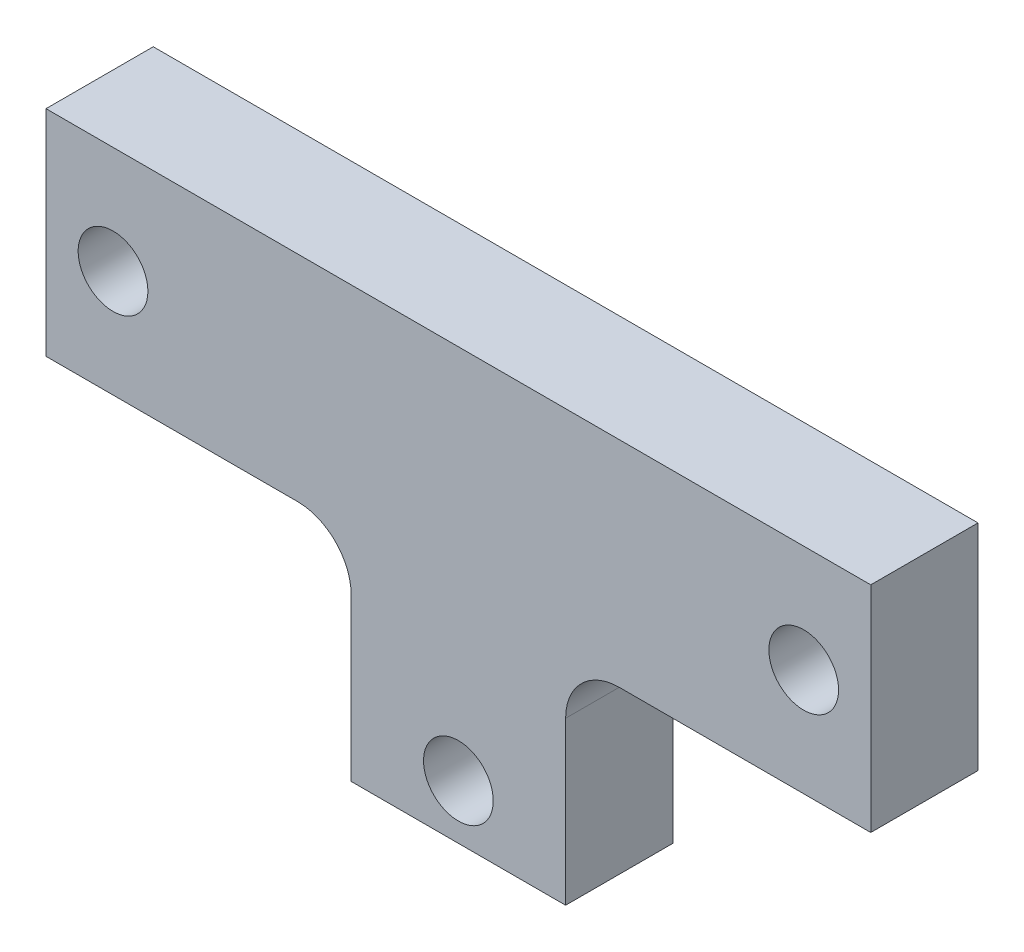
ISO-10303-21;
HEADER;
FILE_DESCRIPTION(('STEP AP214'),'2;1');
FILE_NAME('part.step','',(''),(''),'','','');
FILE_SCHEMA(('AUTOMOTIVE_DESIGN { 1 0 10303 214 1 1 1 1 }'));
ENDSEC;
DATA;
#1=APPLICATION_CONTEXT('core data for automotive mechanical design processes');
#2=APPLICATION_PROTOCOL_DEFINITION('international standard','automotive_design',2000,#1);
#3=PRODUCT_CONTEXT('',#1,'mechanical');
#4=PRODUCT('Part','Part','',(#3));
#5=PRODUCT_RELATED_PRODUCT_CATEGORY('part','',(#4));
#6=PRODUCT_DEFINITION_FORMATION('','',#4);
#7=PRODUCT_DEFINITION_CONTEXT('part definition',#1,'design');
#8=PRODUCT_DEFINITION('design','',#6,#7);
#9=PRODUCT_DEFINITION_SHAPE('','',#8);
#10=(LENGTH_UNIT() NAMED_UNIT(*) SI_UNIT(.MILLI.,.METRE.));
#11=(NAMED_UNIT(*) PLANE_ANGLE_UNIT() SI_UNIT($,.RADIAN.));
#12=(NAMED_UNIT(*) SI_UNIT($,.STERADIAN.) SOLID_ANGLE_UNIT());
#13=UNCERTAINTY_MEASURE_WITH_UNIT(LENGTH_MEASURE(1.E-05),#10,'distance_accuracy_value','');
#14=(GEOMETRIC_REPRESENTATION_CONTEXT(3) GLOBAL_UNCERTAINTY_ASSIGNED_CONTEXT((#13)) GLOBAL_UNIT_ASSIGNED_CONTEXT((#10,
#11,#12)) REPRESENTATION_CONTEXT('',''));
#15=CARTESIAN_POINT('',(0.,0.,0.));
#16=DIRECTION('',(0.,0.,1.));
#17=DIRECTION('',(1.,0.,0.));
#18=AXIS2_PLACEMENT_3D('',#15,#16,#17);
#19=CARTESIAN_POINT('',(42.2,10.,0.));
#20=DIRECTION('',(0.,0.,1.));
#21=DIRECTION('',(1.,0.,0.));
#22=AXIS2_PLACEMENT_3D('',#19,#20,#21);
#23=CYLINDRICAL_SURFACE('',#22,2.);
#24=CARTESIAN_POINT('',(42.2,10.,0.));
#25=DIRECTION('',(0.,0.,1.));
#26=DIRECTION('',(-1.,0.,0.));
#27=AXIS2_PLACEMENT_3D('',#24,#25,#26);
#28=CIRCLE('',#27,2.);
#29=CARTESIAN_POINT('',(40.2,10.,0.));
#30=VERTEX_POINT('',#29);
#31=EDGE_CURVE('E199',#30,#30,#28,.T.);
#32=ORIENTED_EDGE('',*,*,#31,.F.);
#33=EDGE_LOOP('',(#32));
#34=FACE_BOUND('',#33,.T.);
#35=CARTESIAN_POINT('',(42.2,10.,4.));
#36=DIRECTION('',(0.,0.,1.));
#37=DIRECTION('',(1.,0.,0.));
#38=AXIS2_PLACEMENT_3D('',#35,#36,#37);
#39=CIRCLE('',#38,2.);
#40=CARTESIAN_POINT('',(44.2,10.,4.));
#41=VERTEX_POINT('',#40);
#42=EDGE_CURVE('E203',#41,#41,#39,.F.);
#43=ORIENTED_EDGE('',*,*,#42,.F.);
#44=EDGE_LOOP('',(#43));
#45=FACE_BOUND('',#44,.T.);
#46=ADVANCED_FACE('F39',(#34,#45),#23,.F.);
#47=CARTESIAN_POINT('',(10.,-15.05,0.));
#48=DIRECTION('',(0.,0.,1.));
#49=DIRECTION('',(1.,0.,0.));
#50=AXIS2_PLACEMENT_3D('',#47,#48,#49);
#51=CYLINDRICAL_SURFACE('',#50,2.);
#52=CARTESIAN_POINT('',(10.,-15.05,0.));
#53=DIRECTION('',(0.,0.,1.));
#54=DIRECTION('',(1.,0.,0.));
#55=AXIS2_PLACEMENT_3D('',#52,#53,#54);
#56=CIRCLE('',#55,2.);
#57=CARTESIAN_POINT('',(12.,-15.05,0.));
#58=VERTEX_POINT('',#57);
#59=EDGE_CURVE('E195',#58,#58,#56,.T.);
#60=ORIENTED_EDGE('',*,*,#59,.F.);
#61=EDGE_LOOP('',(#60));
#62=FACE_BOUND('',#61,.T.);
#63=CARTESIAN_POINT('',(10.,-15.05,4.));
#64=DIRECTION('',(0.,0.,1.));
#65=DIRECTION('',(1.,0.,0.));
#66=AXIS2_PLACEMENT_3D('',#63,#64,#65);
#67=CIRCLE('',#66,2.);
#68=CARTESIAN_POINT('',(12.,-15.05,4.));
#69=VERTEX_POINT('',#68);
#70=EDGE_CURVE('E247',#69,#69,#67,.F.);
#71=ORIENTED_EDGE('',*,*,#70,.F.);
#72=EDGE_LOOP('',(#71));
#73=FACE_BOUND('',#72,.T.);
#74=ADVANCED_FACE('F295',(#62,#73),#51,.F.);
#75=CARTESIAN_POINT('',(-22.2,9.99999999999999,0.));
#76=DIRECTION('',(0.,0.,1.));
#77=DIRECTION('',(1.,0.,0.));
#78=AXIS2_PLACEMENT_3D('',#75,#76,#77);
#79=CYLINDRICAL_SURFACE('',#78,2.);
#80=CARTESIAN_POINT('',(-22.2,9.99999999999999,0.));
#81=DIRECTION('',(0.,0.,1.));
#82=DIRECTION('',(1.,0.,0.));
#83=AXIS2_PLACEMENT_3D('',#80,#81,#82);
#84=CIRCLE('',#83,2.);
#85=CARTESIAN_POINT('',(-20.2,9.99999999999999,0.));
#86=VERTEX_POINT('',#85);
#87=EDGE_CURVE('E127',#86,#86,#84,.T.);
#88=ORIENTED_EDGE('',*,*,#87,.F.);
#89=EDGE_LOOP('',(#88));
#90=FACE_BOUND('',#89,.T.);
#91=CARTESIAN_POINT('',(-22.2,9.99999999999999,4.));
#92=DIRECTION('',(0.,0.,1.));
#93=DIRECTION('',(1.,0.,0.));
#94=AXIS2_PLACEMENT_3D('',#91,#92,#93);
#95=CIRCLE('',#94,2.);
#96=CARTESIAN_POINT('',(-20.2,9.99999999999999,4.));
#97=VERTEX_POINT('',#96);
#98=EDGE_CURVE('E172',#97,#97,#95,.F.);
#99=ORIENTED_EDGE('',*,*,#98,.F.);
#100=EDGE_LOOP('',(#99));
#101=FACE_BOUND('',#100,.T.);
#102=ADVANCED_FACE('F301',(#90,#101),#79,.F.);
#103=CARTESIAN_POINT('',(-26.45,0.,10.));
#104=DIRECTION('',(0.,1.,0.));
#105=DIRECTION('',(0.,0.,1.));
#106=AXIS2_PLACEMENT_3D('',#103,#104,#105);
#107=PLANE('',#106);
#108=DIRECTION('',(1.,0.,0.));
#109=VECTOR('',#108,1.);
#110=CARTESIAN_POINT('',(-26.45,0.,0.));
#111=LINE('',#110,#109);
#112=CARTESIAN_POINT('',(-28.45,0.,0.));
#113=VERTEX_POINT('',#112);
#114=CARTESIAN_POINT('',(-5.,0.,0.));
#115=VERTEX_POINT('',#114);
#116=EDGE_CURVE('E116',#113,#115,#111,.T.);
#117=ORIENTED_EDGE('',*,*,#116,.T.);
#118=DIRECTION('',(0.,0.,-1.));
#119=VECTOR('',#118,1.);
#120=CARTESIAN_POINT('',(-5.,0.,10.));
#121=LINE('',#120,#119);
#122=CARTESIAN_POINT('',(-5.,0.,10.));
#123=VERTEX_POINT('',#122);
#124=EDGE_CURVE('E257',#115,#123,#121,.F.);
#125=ORIENTED_EDGE('',*,*,#124,.T.);
#126=DIRECTION('',(1.,0.,0.));
#127=VECTOR('',#126,1.);
#128=CARTESIAN_POINT('',(-26.45,0.,10.));
#129=LINE('',#128,#127);
#130=CARTESIAN_POINT('',(-28.45,0.,10.));
#131=VERTEX_POINT('',#130);
#132=EDGE_CURVE('E133',#131,#123,#129,.T.);
#133=ORIENTED_EDGE('',*,*,#132,.F.);
#134=DIRECTION('',(0.,0.,1.));
#135=VECTOR('',#134,1.);
#136=CARTESIAN_POINT('',(-28.45,0.,0.));
#137=LINE('',#136,#135);
#138=EDGE_CURVE('E130',#113,#131,#137,.T.);
#139=ORIENTED_EDGE('',*,*,#138,.F.);
#140=EDGE_LOOP('',(#117,#125,#133,#139));
#141=FACE_BOUND('',#140,.T.);
#142=ADVANCED_FACE('F131',(#141),#107,.F.);
#143=CARTESIAN_POINT('',(0.,0.,10.));
#144=DIRECTION('',(1.,0.,0.));
#145=DIRECTION('',(0.,1.,0.));
#146=AXIS2_PLACEMENT_3D('',#143,#144,#145);
#147=PLANE('',#146);
#148=DIRECTION('',(0.,-1.,0.));
#149=VECTOR('',#148,1.);
#150=CARTESIAN_POINT('',(0.,0.,10.));
#151=LINE('',#150,#149);
#152=CARTESIAN_POINT('',(0.,-5.,10.));
#153=VERTEX_POINT('',#152);
#154=CARTESIAN_POINT('',(0.,-20.1,10.));
#155=VERTEX_POINT('',#154);
#156=EDGE_CURVE('E206',#153,#155,#151,.T.);
#157=ORIENTED_EDGE('',*,*,#156,.F.);
#158=DIRECTION('',(0.,0.,-1.));
#159=VECTOR('',#158,1.);
#160=CARTESIAN_POINT('',(0.,-5.,0.));
#161=LINE('',#160,#159);
#162=CARTESIAN_POINT('',(0.,-5.,0.));
#163=VERTEX_POINT('',#162);
#164=EDGE_CURVE('E243',#153,#163,#161,.T.);
#165=ORIENTED_EDGE('',*,*,#164,.T.);
#166=DIRECTION('',(0.,-1.,0.));
#167=VECTOR('',#166,1.);
#168=CARTESIAN_POINT('',(0.,0.,0.));
#169=LINE('',#168,#167);
#170=CARTESIAN_POINT('',(0.,-20.1,0.));
#171=VERTEX_POINT('',#170);
#172=EDGE_CURVE('E126',#163,#171,#169,.T.);
#173=ORIENTED_EDGE('',*,*,#172,.T.);
#174=DIRECTION('',(0.,0.,-1.));
#175=VECTOR('',#174,1.);
#176=CARTESIAN_POINT('',(0.,-20.1,10.));
#177=LINE('',#176,#175);
#178=EDGE_CURVE('E239',#155,#171,#177,.T.);
#179=ORIENTED_EDGE('',*,*,#178,.F.);
#180=EDGE_LOOP('',(#157,#165,#173,#179));
#181=FACE_BOUND('',#180,.T.);
#182=ADVANCED_FACE('F279',(#181),#147,.F.);
#183=CARTESIAN_POINT('',(0.,-20.1,10.));
#184=DIRECTION('',(0.,1.,0.));
#185=DIRECTION('',(-1.,0.,0.));
#186=AXIS2_PLACEMENT_3D('',#183,#184,#185);
#187=PLANE('',#186);
#188=DIRECTION('',(1.,0.,0.));
#189=VECTOR('',#188,1.);
#190=CARTESIAN_POINT('',(0.,-20.1,0.));
#191=LINE('',#190,#189);
#192=CARTESIAN_POINT('',(20.,-20.1,0.));
#193=VERTEX_POINT('',#192);
#194=EDGE_CURVE('E225',#171,#193,#191,.T.);
#195=ORIENTED_EDGE('',*,*,#194,.T.);
#196=DIRECTION('',(0.,0.,-1.));
#197=VECTOR('',#196,1.);
#198=CARTESIAN_POINT('',(20.,-20.1,10.));
#199=LINE('',#198,#197);
#200=CARTESIAN_POINT('',(20.,-20.1,10.));
#201=VERTEX_POINT('',#200);
#202=EDGE_CURVE('E221',#201,#193,#199,.T.);
#203=ORIENTED_EDGE('',*,*,#202,.F.);
#204=DIRECTION('',(1.,0.,0.));
#205=VECTOR('',#204,1.);
#206=CARTESIAN_POINT('',(0.,-20.1,10.));
#207=LINE('',#206,#205);
#208=EDGE_CURVE('E210',#155,#201,#207,.T.);
#209=ORIENTED_EDGE('',*,*,#208,.F.);
#210=ORIENTED_EDGE('',*,*,#178,.T.);
#211=EDGE_LOOP('',(#195,#203,#209,#210));
#212=FACE_BOUND('',#211,.T.);
#213=ADVANCED_FACE('F326',(#212),#187,.F.);
#214=CARTESIAN_POINT('',(20.,-20.1,10.));
#215=DIRECTION('',(-1.,0.,0.));
#216=DIRECTION('',(0.,-1.,0.));
#217=AXIS2_PLACEMENT_3D('',#214,#215,#216);
#218=PLANE('',#217);
#219=DIRECTION('',(0.,1.,0.));
#220=VECTOR('',#219,1.);
#221=CARTESIAN_POINT('',(20.,-20.1,0.));
#222=LINE('',#221,#220);
#223=CARTESIAN_POINT('',(20.,-5.,0.));
#224=VERTEX_POINT('',#223);
#225=EDGE_CURVE('E228',#193,#224,#222,.T.);
#226=ORIENTED_EDGE('',*,*,#225,.T.);
#227=DIRECTION('',(0.,0.,-1.));
#228=VECTOR('',#227,1.);
#229=CARTESIAN_POINT('',(20.,-5.,10.));
#230=LINE('',#229,#228);
#231=CARTESIAN_POINT('',(20.,-5.,10.));
#232=VERTEX_POINT('',#231);
#233=EDGE_CURVE('E55',#224,#232,#230,.F.);
#234=ORIENTED_EDGE('',*,*,#233,.T.);
#235=DIRECTION('',(0.,1.,0.));
#236=VECTOR('',#235,1.);
#237=CARTESIAN_POINT('',(20.,-20.1,10.));
#238=LINE('',#237,#236);
#239=EDGE_CURVE('E213',#201,#232,#238,.T.);
#240=ORIENTED_EDGE('',*,*,#239,.F.);
#241=ORIENTED_EDGE('',*,*,#202,.T.);
#242=EDGE_LOOP('',(#226,#234,#240,#241));
#243=FACE_BOUND('',#242,.T.);
#244=ADVANCED_FACE('F322',(#243),#218,.F.);
#245=CARTESIAN_POINT('',(20.,0.,10.));
#246=DIRECTION('',(0.,1.,0.));
#247=DIRECTION('',(0.,0.,1.));
#248=AXIS2_PLACEMENT_3D('',#245,#246,#247);
#249=PLANE('',#248);
#250=DIRECTION('',(1.,0.,0.));
#251=VECTOR('',#250,1.);
#252=CARTESIAN_POINT('',(20.,0.,10.));
#253=LINE('',#252,#251);
#254=CARTESIAN_POINT('',(25.,0.,10.));
#255=VERTEX_POINT('',#254);
#256=CARTESIAN_POINT('',(48.45,0.,10.));
#257=VERTEX_POINT('',#256);
#258=EDGE_CURVE('E216',#255,#257,#253,.T.);
#259=ORIENTED_EDGE('',*,*,#258,.F.);
#260=DIRECTION('',(0.,0.,-1.));
#261=VECTOR('',#260,1.);
#262=CARTESIAN_POINT('',(25.,0.,0.));
#263=LINE('',#262,#261);
#264=CARTESIAN_POINT('',(25.,0.,0.));
#265=VERTEX_POINT('',#264);
#266=EDGE_CURVE('E260',#255,#265,#263,.T.);
#267=ORIENTED_EDGE('',*,*,#266,.T.);
#268=DIRECTION('',(1.,0.,0.));
#269=VECTOR('',#268,1.);
#270=CARTESIAN_POINT('',(20.,0.,0.));
#271=LINE('',#270,#269);
#272=CARTESIAN_POINT('',(48.45,0.,0.));
#273=VERTEX_POINT('',#272);
#274=EDGE_CURVE('E231',#265,#273,#271,.T.);
#275=ORIENTED_EDGE('',*,*,#274,.T.);
#276=DIRECTION('',(0.,0.,-1.));
#277=VECTOR('',#276,1.);
#278=CARTESIAN_POINT('',(48.45,0.,10.));
#279=LINE('',#278,#277);
#280=EDGE_CURVE('E155',#257,#273,#279,.T.);
#281=ORIENTED_EDGE('',*,*,#280,.F.);
#282=EDGE_LOOP('',(#259,#267,#275,#281));
#283=FACE_BOUND('',#282,.T.);
#284=ADVANCED_FACE('F318',(#283),#249,.F.);
#285=CARTESIAN_POINT('',(46.45,20.,10.));
#286=DIRECTION('',(0.,-1.,0.));
#287=DIRECTION('',(1.,0.,0.));
#288=AXIS2_PLACEMENT_3D('',#285,#286,#287);
#289=PLANE('',#288);
#290=DIRECTION('',(-1.,0.,0.));
#291=VECTOR('',#290,1.);
#292=CARTESIAN_POINT('',(46.45,20.,0.));
#293=LINE('',#292,#291);
#294=CARTESIAN_POINT('',(48.45,20.,0.));
#295=VERTEX_POINT('',#294);
#296=CARTESIAN_POINT('',(-28.45,20.,0.));
#297=VERTEX_POINT('',#296);
#298=EDGE_CURVE('E207',#295,#297,#293,.T.);
#299=ORIENTED_EDGE('',*,*,#298,.T.);
#300=DIRECTION('',(0.,0.,-1.));
#301=VECTOR('',#300,1.);
#302=CARTESIAN_POINT('',(-28.45,20.,0.));
#303=LINE('',#302,#301);
#304=CARTESIAN_POINT('',(-28.45,20.,10.));
#305=VERTEX_POINT('',#304);
#306=EDGE_CURVE('E143',#305,#297,#303,.T.);
#307=ORIENTED_EDGE('',*,*,#306,.F.);
#308=DIRECTION('',(-1.,0.,0.));
#309=VECTOR('',#308,1.);
#310=CARTESIAN_POINT('',(46.45,20.,10.));
#311=LINE('',#310,#309);
#312=CARTESIAN_POINT('',(48.45,20.,10.));
#313=VERTEX_POINT('',#312);
#314=EDGE_CURVE('E219',#313,#305,#311,.T.);
#315=ORIENTED_EDGE('',*,*,#314,.F.);
#316=DIRECTION('',(0.,0.,1.));
#317=VECTOR('',#316,1.);
#318=CARTESIAN_POINT('',(48.45,20.,10.));
#319=LINE('',#318,#317);
#320=EDGE_CURVE('E163',#295,#313,#319,.T.);
#321=ORIENTED_EDGE('',*,*,#320,.F.);
#322=EDGE_LOOP('',(#299,#307,#315,#321));
#323=FACE_BOUND('',#322,.T.);
#324=ADVANCED_FACE('F310',(#323),#289,.F.);
#325=CARTESIAN_POINT('',(0.,0.,10.));
#326=DIRECTION('',(0.,0.,-1.));
#327=DIRECTION('',(-1.,0.,0.));
#328=AXIS2_PLACEMENT_3D('',#325,#326,#327);
#329=PLANE('',#328);
#330=CARTESIAN_POINT('',(-22.2,9.99999999999999,10.));
#331=DIRECTION('',(0.,0.,1.));
#332=DIRECTION('',(1.,0.,0.));
#333=AXIS2_PLACEMENT_3D('',#330,#331,#332);
#334=CIRCLE('',#333,3.25);
#335=CARTESIAN_POINT('',(-18.95,9.99999999999999,10.));
#336=VERTEX_POINT('',#335);
#337=EDGE_CURVE('E173',#336,#336,#334,.T.);
#338=ORIENTED_EDGE('',*,*,#337,.F.);
#339=EDGE_LOOP('',(#338));
#340=FACE_BOUND('',#339,.T.);
#341=CARTESIAN_POINT('',(42.2,10.,10.));
#342=DIRECTION('',(0.,0.,1.));
#343=DIRECTION('',(1.,0.,0.));
#344=AXIS2_PLACEMENT_3D('',#341,#342,#343);
#345=CIRCLE('',#344,3.25);
#346=CARTESIAN_POINT('',(45.45,10.,10.));
#347=VERTEX_POINT('',#346);
#348=EDGE_CURVE('E181',#347,#347,#345,.T.);
#349=ORIENTED_EDGE('',*,*,#348,.F.);
#350=EDGE_LOOP('',(#349));
#351=FACE_BOUND('',#350,.T.);
#352=CARTESIAN_POINT('',(10.,-15.05,10.));
#353=DIRECTION('',(0.,0.,1.));
#354=DIRECTION('',(1.,0.,0.));
#355=AXIS2_PLACEMENT_3D('',#352,#353,#354);
#356=CIRCLE('',#355,3.25);
#357=CARTESIAN_POINT('',(13.25,-15.05,10.));
#358=VERTEX_POINT('',#357);
#359=EDGE_CURVE('E167',#358,#358,#356,.T.);
#360=ORIENTED_EDGE('',*,*,#359,.F.);
#361=EDGE_LOOP('',(#360));
#362=FACE_BOUND('',#361,.T.);
#363=ORIENTED_EDGE('',*,*,#132,.T.);
#364=CARTESIAN_POINT('',(-5.,-5.,10.));
#365=DIRECTION('',(0.,0.,-1.));
#366=DIRECTION('',(-1.,0.,0.));
#367=AXIS2_PLACEMENT_3D('',#364,#365,#366);
#368=CIRCLE('',#367,5.);
#369=EDGE_CURVE('E268',#123,#153,#368,.T.);
#370=ORIENTED_EDGE('',*,*,#369,.T.);
#371=ORIENTED_EDGE('',*,*,#156,.T.);
#372=ORIENTED_EDGE('',*,*,#208,.T.);
#373=ORIENTED_EDGE('',*,*,#239,.T.);
#374=CARTESIAN_POINT('',(25.,-5.,10.));
#375=DIRECTION('',(0.,0.,-1.));
#376=DIRECTION('',(-1.,0.,0.));
#377=AXIS2_PLACEMENT_3D('',#374,#375,#376);
#378=CIRCLE('',#377,5.);
#379=EDGE_CURVE('E11',#232,#255,#378,.T.);
#380=ORIENTED_EDGE('',*,*,#379,.T.);
#381=ORIENTED_EDGE('',*,*,#258,.T.);
#382=DIRECTION('',(0.,-1.,0.));
#383=VECTOR('',#382,1.);
#384=CARTESIAN_POINT('',(48.45,20.,10.));
#385=LINE('',#384,#383);
#386=EDGE_CURVE('E151',#313,#257,#385,.T.);
#387=ORIENTED_EDGE('',*,*,#386,.F.);
#388=ORIENTED_EDGE('',*,*,#314,.T.);
#389=DIRECTION('',(0.,1.,0.));
#390=VECTOR('',#389,1.);
#391=CARTESIAN_POINT('',(-28.45,20.,10.));
#392=LINE('',#391,#390);
#393=EDGE_CURVE('E138',#131,#305,#392,.T.);
#394=ORIENTED_EDGE('',*,*,#393,.F.);
#395=EDGE_LOOP('',(#363,#370,#371,#372,#373,#380,#381,#387,#388,#394));
#396=FACE_BOUND('',#395,.T.);
#397=ADVANCED_FACE('F274',(#340,#351,#362,#396),#329,.F.);
#398=CARTESIAN_POINT('',(0.,0.,0.));
#399=DIRECTION('',(0.,0.,-1.));
#400=DIRECTION('',(-1.,0.,0.));
#401=AXIS2_PLACEMENT_3D('',#398,#399,#400);
#402=PLANE('',#401);
#403=ORIENTED_EDGE('',*,*,#87,.T.);
#404=EDGE_LOOP('',(#403));
#405=FACE_BOUND('',#404,.T.);
#406=ORIENTED_EDGE('',*,*,#59,.T.);
#407=EDGE_LOOP('',(#406));
#408=FACE_BOUND('',#407,.T.);
#409=ORIENTED_EDGE('',*,*,#31,.T.);
#410=EDGE_LOOP('',(#409));
#411=FACE_BOUND('',#410,.T.);
#412=ORIENTED_EDGE('',*,*,#116,.F.);
#413=DIRECTION('',(0.,-1.,0.));
#414=VECTOR('',#413,1.);
#415=CARTESIAN_POINT('',(-28.45,20.,0.));
#416=LINE('',#415,#414);
#417=EDGE_CURVE('E120',#297,#113,#416,.T.);
#418=ORIENTED_EDGE('',*,*,#417,.F.);
#419=ORIENTED_EDGE('',*,*,#298,.F.);
#420=DIRECTION('',(0.,1.,0.));
#421=VECTOR('',#420,1.);
#422=CARTESIAN_POINT('',(48.45,20.,0.));
#423=LINE('',#422,#421);
#424=EDGE_CURVE('E159',#273,#295,#423,.T.);
#425=ORIENTED_EDGE('',*,*,#424,.F.);
#426=ORIENTED_EDGE('',*,*,#274,.F.);
#427=CARTESIAN_POINT('',(25.,-5.,0.));
#428=DIRECTION('',(0.,0.,-1.));
#429=DIRECTION('',(-1.,0.,0.));
#430=AXIS2_PLACEMENT_3D('',#427,#428,#429);
#431=CIRCLE('',#430,5.);
#432=EDGE_CURVE('E48',#265,#224,#431,.F.);
#433=ORIENTED_EDGE('',*,*,#432,.T.);
#434=ORIENTED_EDGE('',*,*,#225,.F.);
#435=ORIENTED_EDGE('',*,*,#194,.F.);
#436=ORIENTED_EDGE('',*,*,#172,.F.);
#437=CARTESIAN_POINT('',(-5.,-5.,0.));
#438=DIRECTION('',(0.,0.,-1.));
#439=DIRECTION('',(-1.,0.,0.));
#440=AXIS2_PLACEMENT_3D('',#437,#438,#439);
#441=CIRCLE('',#440,5.);
#442=EDGE_CURVE('E122',#163,#115,#441,.F.);
#443=ORIENTED_EDGE('',*,*,#442,.T.);
#444=EDGE_LOOP('',(#412,#418,#419,#425,#426,#433,#434,#435,#436,#443));
#445=FACE_BOUND('',#444,.T.);
#446=ADVANCED_FACE('F118',(#405,#408,#411,#445),#402,.T.);
#447=CARTESIAN_POINT('',(-22.2,9.99999999999999,4.));
#448=DIRECTION('',(0.,0.,1.));
#449=DIRECTION('',(1.,0.,0.));
#450=AXIS2_PLACEMENT_3D('',#447,#448,#449);
#451=PLANE('',#450);
#452=CARTESIAN_POINT('',(-22.2,9.99999999999999,4.));
#453=DIRECTION('',(0.,0.,1.));
#454=DIRECTION('',(1.,0.,0.));
#455=AXIS2_PLACEMENT_3D('',#452,#453,#454);
#456=CIRCLE('',#455,3.25);
#457=CARTESIAN_POINT('',(-18.95,9.99999999999999,4.));
#458=VERTEX_POINT('',#457);
#459=EDGE_CURVE('E168',#458,#458,#456,.T.);
#460=ORIENTED_EDGE('',*,*,#459,.T.);
#461=EDGE_LOOP('',(#460));
#462=FACE_BOUND('',#461,.T.);
#463=ORIENTED_EDGE('',*,*,#98,.T.);
#464=EDGE_LOOP('',(#463));
#465=FACE_BOUND('',#464,.T.);
#466=ADVANCED_FACE('F314',(#462,#465),#451,.T.);
#467=CARTESIAN_POINT('',(-22.2,9.99999999999999,4.));
#468=DIRECTION('',(0.,0.,1.));
#469=DIRECTION('',(1.,0.,0.));
#470=AXIS2_PLACEMENT_3D('',#467,#468,#469);
#471=CYLINDRICAL_SURFACE('',#470,3.25);
#472=ORIENTED_EDGE('',*,*,#459,.F.);
#473=EDGE_LOOP('',(#472));
#474=FACE_BOUND('',#473,.T.);
#475=ORIENTED_EDGE('',*,*,#337,.T.);
#476=EDGE_LOOP('',(#475));
#477=FACE_BOUND('',#476,.T.);
#478=ADVANCED_FACE('F347',(#474,#477),#471,.F.);
#479=CARTESIAN_POINT('',(10.,-15.05,4.));
#480=DIRECTION('',(0.,0.,1.));
#481=DIRECTION('',(1.,0.,0.));
#482=AXIS2_PLACEMENT_3D('',#479,#480,#481);
#483=PLANE('',#482);
#484=CARTESIAN_POINT('',(10.,-15.05,4.));
#485=DIRECTION('',(0.,0.,1.));
#486=DIRECTION('',(1.,0.,0.));
#487=AXIS2_PLACEMENT_3D('',#484,#485,#486);
#488=CIRCLE('',#487,3.25);
#489=CARTESIAN_POINT('',(13.25,-15.05,4.));
#490=VERTEX_POINT('',#489);
#491=EDGE_CURVE('E185',#490,#490,#488,.T.);
#492=ORIENTED_EDGE('',*,*,#491,.T.);
#493=EDGE_LOOP('',(#492));
#494=FACE_BOUND('',#493,.T.);
#495=ORIENTED_EDGE('',*,*,#70,.T.);
#496=EDGE_LOOP('',(#495));
#497=FACE_BOUND('',#496,.T.);
#498=ADVANCED_FACE('F344',(#494,#497),#483,.T.);
#499=CARTESIAN_POINT('',(10.,-15.05,4.));
#500=DIRECTION('',(0.,0.,1.));
#501=DIRECTION('',(1.,0.,0.));
#502=AXIS2_PLACEMENT_3D('',#499,#500,#501);
#503=CYLINDRICAL_SURFACE('',#502,3.25);
#504=ORIENTED_EDGE('',*,*,#491,.F.);
#505=EDGE_LOOP('',(#504));
#506=FACE_BOUND('',#505,.T.);
#507=ORIENTED_EDGE('',*,*,#359,.T.);
#508=EDGE_LOOP('',(#507));
#509=FACE_BOUND('',#508,.T.);
#510=ADVANCED_FACE('F341',(#506,#509),#503,.F.);
#511=CARTESIAN_POINT('',(42.2,10.,4.));
#512=DIRECTION('',(0.,0.,1.));
#513=DIRECTION('',(1.,0.,0.));
#514=AXIS2_PLACEMENT_3D('',#511,#512,#513);
#515=PLANE('',#514);
#516=CARTESIAN_POINT('',(42.2,10.,4.));
#517=DIRECTION('',(0.,0.,1.));
#518=DIRECTION('',(1.,0.,0.));
#519=AXIS2_PLACEMENT_3D('',#516,#517,#518);
#520=CIRCLE('',#519,3.25);
#521=CARTESIAN_POINT('',(45.45,10.,4.));
#522=VERTEX_POINT('',#521);
#523=EDGE_CURVE('E177',#522,#522,#520,.T.);
#524=ORIENTED_EDGE('',*,*,#523,.T.);
#525=EDGE_LOOP('',(#524));
#526=FACE_BOUND('',#525,.T.);
#527=ORIENTED_EDGE('',*,*,#42,.T.);
#528=EDGE_LOOP('',(#527));
#529=FACE_BOUND('',#528,.T.);
#530=ADVANCED_FACE('F290',(#526,#529),#515,.T.);
#531=CARTESIAN_POINT('',(42.2,10.,4.));
#532=DIRECTION('',(0.,0.,1.));
#533=DIRECTION('',(1.,0.,0.));
#534=AXIS2_PLACEMENT_3D('',#531,#532,#533);
#535=CYLINDRICAL_SURFACE('',#534,3.25);
#536=ORIENTED_EDGE('',*,*,#523,.F.);
#537=EDGE_LOOP('',(#536));
#538=FACE_BOUND('',#537,.T.);
#539=ORIENTED_EDGE('',*,*,#348,.T.);
#540=EDGE_LOOP('',(#539));
#541=FACE_BOUND('',#540,.T.);
#542=ADVANCED_FACE('F283',(#538,#541),#535,.F.);
#543=CARTESIAN_POINT('',(-5.,-5.,10.));
#544=DIRECTION('',(0.,0.,1.));
#545=DIRECTION('',(1.,0.,0.));
#546=AXIS2_PLACEMENT_3D('',#543,#544,#545);
#547=CYLINDRICAL_SURFACE('',#546,5.);
#548=ORIENTED_EDGE('',*,*,#369,.F.);
#549=ORIENTED_EDGE('',*,*,#124,.F.);
#550=ORIENTED_EDGE('',*,*,#442,.F.);
#551=ORIENTED_EDGE('',*,*,#164,.F.);
#552=EDGE_LOOP('',(#548,#549,#550,#551));
#553=FACE_BOUND('',#552,.T.);
#554=ADVANCED_FACE('F281',(#553),#547,.F.);
#555=CARTESIAN_POINT('',(25.,-5.,10.));
#556=DIRECTION('',(0.,0.,1.));
#557=DIRECTION('',(1.,0.,0.));
#558=AXIS2_PLACEMENT_3D('',#555,#556,#557);
#559=CYLINDRICAL_SURFACE('',#558,5.);
#560=ORIENTED_EDGE('',*,*,#379,.F.);
#561=ORIENTED_EDGE('',*,*,#233,.F.);
#562=ORIENTED_EDGE('',*,*,#432,.F.);
#563=ORIENTED_EDGE('',*,*,#266,.F.);
#564=EDGE_LOOP('',(#560,#561,#562,#563));
#565=FACE_BOUND('',#564,.T.);
#566=ADVANCED_FACE('F41',(#565),#559,.F.);
#567=CARTESIAN_POINT('',(48.45,0.,0.));
#568=DIRECTION('',(1.,0.,0.));
#569=DIRECTION('',(0.,0.,-1.));
#570=AXIS2_PLACEMENT_3D('',#567,#568,#569);
#571=PLANE('',#570);
#572=ORIENTED_EDGE('',*,*,#386,.T.);
#573=ORIENTED_EDGE('',*,*,#280,.T.);
#574=ORIENTED_EDGE('',*,*,#424,.T.);
#575=ORIENTED_EDGE('',*,*,#320,.T.);
#576=EDGE_LOOP('',(#572,#573,#574,#575));
#577=FACE_BOUND('',#576,.T.);
#578=ADVANCED_FACE('F288',(#577),#571,.T.);
#579=CARTESIAN_POINT('',(-28.45,0.,0.));
#580=DIRECTION('',(-1.,0.,0.));
#581=DIRECTION('',(0.,-1.,0.));
#582=AXIS2_PLACEMENT_3D('',#579,#580,#581);
#583=PLANE('',#582);
#584=ORIENTED_EDGE('',*,*,#417,.T.);
#585=ORIENTED_EDGE('',*,*,#138,.T.);
#586=ORIENTED_EDGE('',*,*,#393,.T.);
#587=ORIENTED_EDGE('',*,*,#306,.T.);
#588=EDGE_LOOP('',(#584,#585,#586,#587));
#589=FACE_BOUND('',#588,.T.);
#590=ADVANCED_FACE('F141',(#589),#583,.T.);
#591=CLOSED_SHELL('',(#46,#74,#102,#142,#182,#213,#244,#284,#324,#397,#446,#466,#478,#498,#510,
#530,#542,#554,#566,#578,#590));
#592=MANIFOLD_SOLID_BREP('B2',#591);
#593=ADVANCED_BREP_SHAPE_REPRESENTATION('',(#18,#592),#14);
#594=SHAPE_DEFINITION_REPRESENTATION(#9,#593);
ENDSEC;
END-ISO-10303-21;
